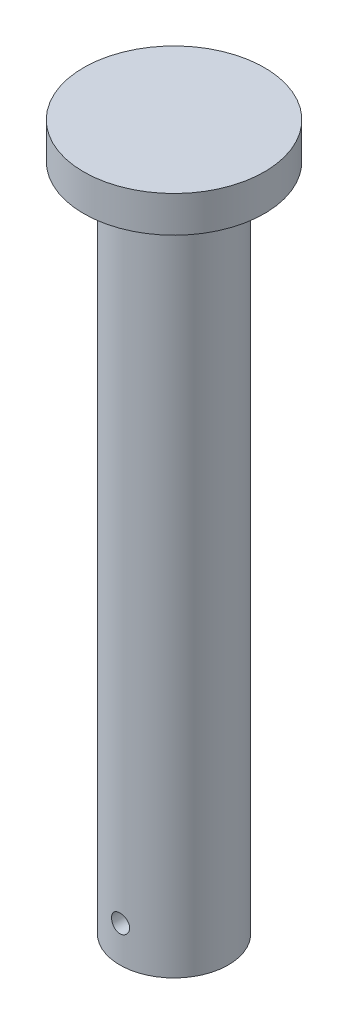
ISO-10303-21;
HEADER;
FILE_DESCRIPTION(('STEP AP214'),'2;1');
FILE_NAME('part.step','',(''),(''),'','','');
FILE_SCHEMA(('AUTOMOTIVE_DESIGN { 1 0 10303 214 1 1 1 1 }'));
ENDSEC;
DATA;
#1=APPLICATION_CONTEXT('core data for automotive mechanical design processes');
#2=APPLICATION_PROTOCOL_DEFINITION('international standard','automotive_design',2000,#1);
#3=PRODUCT_CONTEXT('',#1,'mechanical');
#4=PRODUCT('Part','Part','',(#3));
#5=PRODUCT_RELATED_PRODUCT_CATEGORY('part','',(#4));
#6=PRODUCT_DEFINITION_FORMATION('','',#4);
#7=PRODUCT_DEFINITION_CONTEXT('part definition',#1,'design');
#8=PRODUCT_DEFINITION('design','',#6,#7);
#9=PRODUCT_DEFINITION_SHAPE('','',#8);
#10=(LENGTH_UNIT() NAMED_UNIT(*) SI_UNIT(.MILLI.,.METRE.));
#11=(NAMED_UNIT(*) PLANE_ANGLE_UNIT() SI_UNIT($,.RADIAN.));
#12=(NAMED_UNIT(*) SI_UNIT($,.STERADIAN.) SOLID_ANGLE_UNIT());
#13=UNCERTAINTY_MEASURE_WITH_UNIT(LENGTH_MEASURE(1.E-05),#10,'distance_accuracy_value','');
#14=(GEOMETRIC_REPRESENTATION_CONTEXT(3) GLOBAL_UNCERTAINTY_ASSIGNED_CONTEXT((#13)) GLOBAL_UNIT_ASSIGNED_CONTEXT((#10,
#11,#12)) REPRESENTATION_CONTEXT('',''));
#15=CARTESIAN_POINT('',(0.,0.,0.));
#16=DIRECTION('',(0.,0.,1.));
#17=DIRECTION('',(1.,0.,0.));
#18=AXIS2_PLACEMENT_3D('',#15,#16,#17);
#19=CARTESIAN_POINT('',(0.,5.,0.));
#20=DIRECTION('',(0.,-1.,0.));
#21=DIRECTION('',(0.,0.,-1.));
#22=AXIS2_PLACEMENT_3D('',#19,#20,#21);
#23=CYLINDRICAL_SURFACE('',#22,25.);
#24=CARTESIAN_POINT('',(0.,5.,0.));
#25=DIRECTION('',(0.,1.,0.));
#26=DIRECTION('',(0.,0.,1.));
#27=AXIS2_PLACEMENT_3D('',#24,#25,#26);
#28=CIRCLE('',#27,25.);
#29=CARTESIAN_POINT('',(0.,5.,25.));
#30=VERTEX_POINT('',#29);
#31=EDGE_CURVE('E47',#30,#30,#28,.T.);
#32=ORIENTED_EDGE('',*,*,#31,.F.);
#33=EDGE_LOOP('',(#32));
#34=FACE_BOUND('',#33,.T.);
#35=CARTESIAN_POINT('',(0.,-5.,0.));
#36=DIRECTION('',(0.,1.,0.));
#37=DIRECTION('',(0.,0.,1.));
#38=AXIS2_PLACEMENT_3D('',#35,#36,#37);
#39=CIRCLE('',#38,25.);
#40=CARTESIAN_POINT('',(0.,-5.,25.));
#41=VERTEX_POINT('',#40);
#42=EDGE_CURVE('E52',#41,#41,#39,.T.);
#43=ORIENTED_EDGE('',*,*,#42,.T.);
#44=EDGE_LOOP('',(#43));
#45=FACE_BOUND('',#44,.T.);
#46=ADVANCED_FACE('F35',(#34,#45),#23,.T.);
#47=CARTESIAN_POINT('',(0.,5.,0.));
#48=DIRECTION('',(0.,1.,0.));
#49=DIRECTION('',(0.,0.,1.));
#50=AXIS2_PLACEMENT_3D('',#47,#48,#49);
#51=PLANE('',#50);
#52=ORIENTED_EDGE('',*,*,#31,.T.);
#53=EDGE_LOOP('',(#52));
#54=FACE_BOUND('',#53,.T.);
#55=ADVANCED_FACE('F82',(#54),#51,.T.);
#56=CARTESIAN_POINT('',(0.,-5.,0.));
#57=DIRECTION('',(0.,1.,0.));
#58=DIRECTION('',(0.,0.,1.));
#59=AXIS2_PLACEMENT_3D('',#56,#57,#58);
#60=PLANE('',#59);
#61=CARTESIAN_POINT('',(0.,-5.,0.));
#62=DIRECTION('',(0.,-1.,0.));
#63=DIRECTION('',(0.,0.,-1.));
#64=AXIS2_PLACEMENT_3D('',#61,#62,#63);
#65=CIRCLE('',#64,15.);
#66=CARTESIAN_POINT('',(0.,-5.,-15.));
#67=VERTEX_POINT('',#66);
#68=EDGE_CURVE('E10',#67,#67,#65,.T.);
#69=ORIENTED_EDGE('',*,*,#68,.F.);
#70=EDGE_LOOP('',(#69));
#71=FACE_BOUND('',#70,.T.);
#72=ORIENTED_EDGE('',*,*,#42,.F.);
#73=EDGE_LOOP('',(#72));
#74=FACE_BOUND('',#73,.T.);
#75=ADVANCED_FACE('F78',(#71,#74),#60,.F.);
#76=CARTESIAN_POINT('',(0.,-190.,0.));
#77=DIRECTION('',(0.,1.,0.));
#78=DIRECTION('',(0.,0.,1.));
#79=AXIS2_PLACEMENT_3D('',#76,#77,#78);
#80=CYLINDRICAL_SURFACE('',#79,15.);
#81=CARTESIAN_POINT('',(0.,-182.5,15.));
#82=CARTESIAN_POINT('',(-0.139390904958215,-182.499994411052,14.9999976116882));
#83=CARTESIAN_POINT('',(-0.278857881838821,-182.488302725031,14.9980367791303));
#84=CARTESIAN_POINT('',(-0.553880221673043,-182.441864341235,14.9904034494139));
#85=CARTESIAN_POINT('',(-0.689431867959248,-182.407096443088,14.9847275392389));
#86=CARTESIAN_POINT('',(-0.952604747212644,-182.315584551407,14.9703006823645));
#87=CARTESIAN_POINT('',(-1.0802323684319,-182.258858534359,14.9615522515919));
#88=CARTESIAN_POINT('',(-1.32414184197794,-182.125087707948,14.9419422708207));
#89=CARTESIAN_POINT('',(-1.44042498987859,-182.048045222517,14.9310809625443));
#90=CARTESIAN_POINT('',(-1.65947261429168,-181.87504491618,14.9083331745831));
#91=CARTESIAN_POINT('',(-1.76211290353497,-181.778930885364,14.8964387181486));
#92=CARTESIAN_POINT('',(-1.94988849865993,-181.570852031527,14.8730262687673));
#93=CARTESIAN_POINT('',(-2.03502269939097,-181.458886208543,14.8615082996267));
#94=CARTESIAN_POINT('',(-2.18586712560513,-181.221429033803,14.8400756575978));
#95=CARTESIAN_POINT('',(-2.251454552861,-181.095858663195,14.8301712909164));
#96=CARTESIAN_POINT('',(-2.36055836541122,-180.835290435699,14.8131978979467));
#97=CARTESIAN_POINT('',(-2.40407624156562,-180.700293216322,14.8061286801431));
#98=CARTESIAN_POINT('',(-2.46741437778481,-180.426019725143,14.7957053684276));
#99=CARTESIAN_POINT('',(-2.4874490291354,-180.286794263499,14.792317684857));
#100=CARTESIAN_POINT('',(-2.50391672528988,-180.006919723117,14.7895393893665));
#101=CARTESIAN_POINT('',(-2.500351440389,-179.866270745833,14.7901484945721));
#102=CARTESIAN_POINT('',(-2.46989509839615,-179.589072138725,14.7952642886356));
#103=CARTESIAN_POINT('',(-2.44324488188977,-179.452495196455,14.7997307331892));
#104=CARTESIAN_POINT('',(-2.36775314040344,-179.185778682171,14.8119949521101));
#105=CARTESIAN_POINT('',(-2.31891085431974,-179.055639331111,14.8197928407327));
#106=CARTESIAN_POINT('',(-2.20017724609391,-178.804771176559,14.837884793341));
#107=CARTESIAN_POINT('',(-2.13018591387971,-178.684090593919,14.8481906710733));
#108=CARTESIAN_POINT('',(-1.97121201755743,-178.456095599462,14.8701291841501));
#109=CARTESIAN_POINT('',(-1.88222792065428,-178.348782267545,14.8817619265429));
#110=CARTESIAN_POINT('',(-1.68648221215905,-178.149173914193,14.9052202787979));
#111=CARTESIAN_POINT('',(-1.57951396387313,-178.05708148146,14.9170464923165));
#112=CARTESIAN_POINT('',(-1.35153524898165,-177.892122237335,14.9394260139672));
#113=CARTESIAN_POINT('',(-1.23052469190644,-177.819255549817,14.9499793138974));
#114=CARTESIAN_POINT('',(-0.977705916166733,-177.694797772864,14.9686389289291));
#115=CARTESIAN_POINT('',(-0.845888725564678,-177.643224580669,14.9767431840745));
#116=CARTESIAN_POINT('',(-0.57529834560274,-177.563005784754,14.9895750301266));
#117=CARTESIAN_POINT('',(-0.436525739179473,-177.534358263026,14.9943029035047));
#118=CARTESIAN_POINT('',(-0.157709901301625,-177.501078641539,14.9998112984269));
#119=CARTESIAN_POINT('',(-0.0177007371510126,-177.496168428194,15.0006375301278));
#120=CARTESIAN_POINT('',(0.261139772889886,-177.509761344428,14.9983747442117));
#121=CARTESIAN_POINT('',(0.399971163892038,-177.528263573134,14.9952858772412));
#122=CARTESIAN_POINT('',(0.671656175546762,-177.587924849335,14.985568269382));
#123=CARTESIAN_POINT('',(0.804540868385377,-177.62894620839,14.9789610480131));
#124=CARTESIAN_POINT('',(1.06154688486044,-177.7323345182,14.9629446445536));
#125=CARTESIAN_POINT('',(1.18566771590972,-177.794702667635,14.9535353051202));
#126=CARTESIAN_POINT('',(1.42283068946897,-177.939651124697,14.9328451630241));
#127=CARTESIAN_POINT('',(1.53576525093715,-178.022405156167,14.9215485588702));
#128=CARTESIAN_POINT('',(1.74624358550269,-178.205537315385,14.898384673919));
#129=CARTESIAN_POINT('',(1.84378623969658,-178.305916723277,14.8865173517155));
#130=CARTESIAN_POINT('',(2.02174277965801,-178.522697548071,14.8634017523585));
#131=CARTESIAN_POINT('',(2.10196876111372,-178.639254165514,14.8521611613711));
#132=CARTESIAN_POINT('',(2.24170231029499,-178.884352969139,14.8317152977788));
#133=CARTESIAN_POINT('',(2.30121053476983,-179.012894775227,14.8225099606602));
#134=CARTESIAN_POINT('',(2.39753833147315,-179.277789732812,14.807234536977));
#135=CARTESIAN_POINT('',(2.43445143254794,-179.414108095031,14.8011515431106));
#136=CARTESIAN_POINT('',(2.48483545377828,-179.691120129222,14.7927771683526));
#137=CARTESIAN_POINT('',(2.49830841194617,-179.831813419732,14.7904854578272));
#138=CARTESIAN_POINT('',(2.50137286604735,-180.111705165962,14.7899673308401));
#139=CARTESIAN_POINT('',(2.49126013612519,-180.250900378575,14.7916905650565));
#140=CARTESIAN_POINT('',(2.44807983895685,-180.525579248051,14.7988978145373));
#141=CARTESIAN_POINT('',(2.41501234611248,-180.661062916942,14.8043818176121));
#142=CARTESIAN_POINT('',(2.3269744895949,-180.924358437293,14.8184735628172));
#143=CARTESIAN_POINT('',(2.27202959060043,-181.052179010056,14.8270776721967));
#144=CARTESIAN_POINT('',(2.1418270039159,-181.296835669195,14.8464436892221));
#145=CARTESIAN_POINT('',(2.06656830874856,-181.413671210372,14.857205703884));
#146=CARTESIAN_POINT('',(1.89681888437215,-181.634535583108,14.8798345404562));
#147=CARTESIAN_POINT('',(1.80211056359365,-181.7383960167,14.891712955763));
#148=CARTESIAN_POINT('',(1.59660903138024,-181.928851604475,14.9151437236084));
#149=CARTESIAN_POINT('',(1.48581211291265,-182.015442768638,14.9266960002655));
#150=CARTESIAN_POINT('',(1.25036916964029,-182.1694482682,14.9482652964222));
#151=CARTESIAN_POINT('',(1.12563278753283,-182.236726039313,14.958271162531));
#152=CARTESIAN_POINT('',(0.866513069378982,-182.34926948461,14.9755116760178));
#153=CARTESIAN_POINT('',(0.732139494830003,-182.39455708108,14.9827490817748));
#154=CARTESIAN_POINT('',(0.49770331004539,-182.452005274127,14.9920579083296));
#155=CARTESIAN_POINT('',(0.39905883029844,-182.469974469616,14.9950202727336));
#156=CARTESIAN_POINT('',(0.200289310319806,-182.493973737845,14.9989921598612));
#157=CARTESIAN_POINT('',(0.100164295608492,-182.500004016137,15.0000017162064));
#158=CARTESIAN_POINT('',(0.,-182.5,15.));
#159=B_SPLINE_CURVE_WITH_KNOTS('',3,(#81,#82,#83,#84,#85,#86,#87,#88,#89,#90,#91,#92,#93,#94,
#95,#96,#97,#98,#99,#100,#101,#102,#103,#104,#105,#106,#107,#108,#109,#110,#111,#112,#113,#114,
#115,#116,#117,#118,#119,#120,#121,#122,#123,#124,#125,#126,#127,#128,#129,#130,#131,#132,#133,
#134,#135,#136,#137,#138,#139,#140,#141,#142,#143,#144,#145,#146,#147,#148,#149,#150,#151,#152,
#153,#154,#155,#156,#157,#158),.UNSPECIFIED.,.T.,.F.,(4,2,2,2,2,2,2,2,2,2,2,2,2,2,2,2,2,2,2,2,2,
2,2,2,2,2,2,2,2,2,2,2,2,2,2,2,2,2,4),(0.,0.417806584938511,0.83599754569542,1.25384686702527,
1.67164841267479,2.09302491062332,2.51442800169854,2.9384252082384,3.36239376876183,
3.78246077103426,4.20249804320889,4.61820521760411,5.03392665025382,5.45164556632559,
5.86939820680575,6.29232769911326,6.71525991635845,7.13854688915902,7.56179844521149,
7.98007883491397,8.39834313035859,8.81407807006415,9.22983635826068,9.64926825627026,
10.0687306305428,10.4925382200762,10.9163323737594,11.3383602234177,11.7603513778662,
12.177079095227,12.5938054618813,13.0100481822622,13.4263115502934,13.8475138419339,
14.2688133387897,14.693022316072,15.1168075213007,15.4170424816402,15.7172722727697),.UNSPECIFIED.);
#160=CARTESIAN_POINT('',(0.,-182.5,15.));
#161=VERTEX_POINT('',#160);
#162=EDGE_CURVE('E38',#161,#161,#159,.T.);
#163=ORIENTED_EDGE('',*,*,#162,.T.);
#164=EDGE_LOOP('',(#163));
#165=FACE_BOUND('',#164,.T.);
#166=CARTESIAN_POINT('',(2.5,-180.,-14.790199457749));
#167=CARTESIAN_POINT('',(2.49999439841983,-179.860624251838,-14.790201973666));
#168=CARTESIAN_POINT('',(2.48830516902828,-179.721172393929,-14.7921909238523));
#169=CARTESIAN_POINT('',(2.44187742806638,-179.446181456737,-14.7999245720004));
#170=CARTESIAN_POINT('',(2.40711766030861,-179.310646106242,-14.8056727334637));
#171=CARTESIAN_POINT('',(2.31562954367049,-179.047507716658,-14.8202560936731));
#172=CARTESIAN_POINT('',(2.25891955493198,-178.919898151338,-14.8290887118401));
#173=CARTESIAN_POINT('',(2.12518649688946,-178.676019045282,-14.8488427210228));
#174=CARTESIAN_POINT('',(2.04816571350132,-178.559748230423,-14.8597638769423));
#175=CARTESIAN_POINT('',(1.87518752696653,-178.340687150255,-14.8825847115588));
#176=CARTESIAN_POINT('',(1.77906904893232,-178.238024868614,-14.8944921732795));
#177=CARTESIAN_POINT('',(1.57097200469526,-178.050206693138,-14.9178748066858));
#178=CARTESIAN_POINT('',(1.45899249914996,-177.965051836885,-14.9293499527174));
#179=CARTESIAN_POINT('',(1.22152286994836,-177.814185432781,-14.9506573698271));
#180=CARTESIAN_POINT('',(1.09595608145671,-177.748592992268,-14.9604794243234));
#181=CARTESIAN_POINT('',(0.835395621723877,-177.639478929469,-14.9772873695709));
#182=CARTESIAN_POINT('',(0.700402564078195,-177.595955872115,-14.9842734447266));
#183=CARTESIAN_POINT('',(0.426143726344249,-177.532607465016,-14.994567347244));
#184=CARTESIAN_POINT('',(0.28692888667928,-177.512567083995,-14.9979085311091));
#185=CARTESIAN_POINT('',(0.00707528552580701,-177.496084245847,-15.0006507934278));
#186=CARTESIAN_POINT('',(-0.13356337852889,-177.499640184753,-15.0000521396931));
#187=CARTESIAN_POINT('',(-0.410802185078865,-177.530081351528,-14.9950085843139));
#188=CARTESIAN_POINT('',(-0.547428530700127,-177.556735163409,-14.990601836924));
#189=CARTESIAN_POINT('',(-0.814241979611779,-177.632251074246,-14.9784797877164));
#190=CARTESIAN_POINT('',(-0.944428886651497,-177.681113849589,-14.9707643851321));
#191=CARTESIAN_POINT('',(-1.19535614778264,-177.799890640315,-14.9528269851196));
#192=CARTESIAN_POINT('',(-1.31605052301904,-177.869900012082,-14.9425936732688));
#193=CARTESIAN_POINT('',(-1.54406552984663,-178.028912822635,-14.920757380715));
#194=CARTESIAN_POINT('',(-1.65138507791587,-178.117917798711,-14.9091542891913));
#195=CARTESIAN_POINT('',(-1.85097127344666,-178.313678806619,-14.885702682326));
#196=CARTESIAN_POINT('',(-1.94303950225321,-178.420637094901,-14.8738528973104));
#197=CARTESIAN_POINT('',(-2.10795458844806,-178.648587090216,-14.8513795978481));
#198=CARTESIAN_POINT('',(-2.18080126853242,-178.769578926683,-14.8407560947132));
#199=CARTESIAN_POINT('',(-2.30524443448828,-179.022391641877,-14.8219375456182));
#200=CARTESIAN_POINT('',(-2.35681702727923,-179.154224498092,-14.813745233026));
#201=CARTESIAN_POINT('',(-2.43702987081561,-179.424849072308,-14.8007618868988));
#202=CARTESIAN_POINT('',(-2.46567214076795,-179.563640176432,-14.7959705538832));
#203=CARTESIAN_POINT('',(-2.49893188487927,-179.842466156162,-14.7903895942212));
#204=CARTESIAN_POINT('',(-2.50383220791244,-179.982466379702,-14.7895528575867));
#205=CARTESIAN_POINT('',(-2.49022270268246,-180.261286671691,-14.7918503478236));
#206=CARTESIAN_POINT('',(-2.47171377862467,-180.400106785514,-14.7949844213185));
#207=CARTESIAN_POINT('',(-2.4120523349281,-180.671727759191,-14.8048268745502));
#208=CARTESIAN_POINT('',(-2.37104379064639,-180.804561139878,-14.8115125191835));
#209=CARTESIAN_POINT('',(-2.26769819019229,-181.061470166279,-14.827685730055));
#210=CARTESIAN_POINT('',(-2.20535985810096,-181.185545287551,-14.8371734639058));
#211=CARTESIAN_POINT('',(-2.06045667322925,-181.422674594406,-14.8579912839739));
#212=CARTESIAN_POINT('',(-1.97771056415938,-181.535616572756,-14.8693375560035));
#213=CARTESIAN_POINT('',(-1.79458946570799,-181.746113532695,-14.8925466667987));
#214=CARTESIAN_POINT('',(-1.69421323638406,-181.84366743111,-14.9044095418533));
#215=CARTESIAN_POINT('',(-1.47742807032882,-182.021651892729,-14.9274642211826));
#216=CARTESIAN_POINT('',(-1.3608632533862,-182.101893826285,-14.9386477634467));
#217=CARTESIAN_POINT('',(-1.11574344794933,-182.241655327005,-14.9589511243294));
#218=CARTESIAN_POINT('',(-0.987188847470634,-182.301175564474,-14.9680710096998));
#219=CARTESIAN_POINT('',(-0.722299051501337,-182.397510583955,-14.9831835816958));
#220=CARTESIAN_POINT('',(-0.586000562602617,-182.434424075735,-14.9891898456762));
#221=CARTESIAN_POINT('',(-0.309030734874212,-182.484815598964,-14.9974558316928));
#222=CARTESIAN_POINT('',(-0.16835975682162,-182.498295558732,-14.9997158620019));
#223=CARTESIAN_POINT('',(0.111541275773677,-182.501381882312,-15.0002303788781));
#224=CARTESIAN_POINT('',(0.250768160602664,-182.491275253941,-14.9985330202419));
#225=CARTESIAN_POINT('',(0.525511974314702,-182.448096077731,-14.9914217838733));
#226=CARTESIAN_POINT('',(0.661028923967475,-182.41502365849,-14.9860079269518));
#227=CARTESIAN_POINT('',(0.924396445918529,-182.326961834456,-14.972069888274));
#228=CARTESIAN_POINT('',(1.05225537215381,-182.27199683179,-14.9635491704088));
#229=CARTESIAN_POINT('',(1.29698045298215,-182.141742063769,-14.9443275687803));
#230=CARTESIAN_POINT('',(1.41384608611821,-182.066451334938,-14.9336265816741));
#231=CARTESIAN_POINT('',(1.63471294552638,-181.89666490754,-14.9110762961641));
#232=CARTESIAN_POINT('',(1.73855143060273,-181.801959045249,-14.8992152454112));
#233=CARTESIAN_POINT('',(1.92896387595089,-181.596471692096,-14.8757630331437));
#234=CARTESIAN_POINT('',(2.01553378671188,-181.485686441087,-14.8641719354951));
#235=CARTESIAN_POINT('',(2.16951427091085,-181.25025467751,-14.8424834353391));
#236=CARTESIAN_POINT('',(2.23678498905769,-181.125515660235,-14.8323971784578));
#237=CARTESIAN_POINT('',(2.34931453640427,-180.866390764162,-14.8149921009131));
#238=CARTESIAN_POINT('',(2.39459535522307,-180.732014677323,-14.8076705172488));
#239=CARTESIAN_POINT('',(2.45202605312742,-180.497596230513,-14.7982474485649));
#240=CARTESIAN_POINT('',(2.46998741767139,-180.398973192037,-14.7952462341947));
#241=CARTESIAN_POINT('',(2.49397629518131,-180.200246515163,-14.7912213528807));
#242=CARTESIAN_POINT('',(2.50000402479277,-180.100142903676,-14.7901976500369));
#243=CARTESIAN_POINT('',(2.5,-180.,-14.790199457749));
#244=B_SPLINE_CURVE_WITH_KNOTS('',3,(#166,#167,#168,#169,#170,#171,#172,#173,#174,#175,#176,
#177,#178,#179,#180,#181,#182,#183,#184,#185,#186,#187,#188,#189,#190,#191,#192,#193,#194,#195,
#196,#197,#198,#199,#200,#201,#202,#203,#204,#205,#206,#207,#208,#209,#210,#211,#212,#213,#214,
#215,#216,#217,#218,#219,#220,#221,#222,#223,#224,#225,#226,#227,#228,#229,#230,#231,#232,#233,
#234,#235,#236,#237,#238,#239,#240,#241,#242,#243),.UNSPECIFIED.,.T.,.F.,(4,2,2,2,2,2,2,2,2,2,2,
2,2,2,2,2,2,2,2,2,2,2,2,2,2,2,2,2,2,2,2,2,2,2,2,2,2,2,4),(0.,0.417761038927708,
0.835907519962962,1.25370499787522,1.67145547405275,2.09289159155718,2.51435267834448,
2.93832980111435,3.36227935111112,3.78231567472565,4.20232344652691,4.61817121164667,
5.03403164249533,5.45179604139425,5.86959426226764,6.29246123462125,6.71533210746018,
7.13867662498602,7.56198385938074,7.98023542420408,8.39847083413977,8.81406064635489,
9.22967532293572,9.64912342762701,10.0686010443069,10.4924411303538,10.916267504767,
11.3382298441765,11.7601574591235,12.1769777626592,12.5937957321882,13.0101503983246,
13.4265248039234,13.8476699746325,14.2689137888181,14.6931372761832,15.1169356674445,
15.4171067054376,15.7172722940182),.UNSPECIFIED.);
#245=CARTESIAN_POINT('',(2.5,-180.,-14.790199457749));
#246=VERTEX_POINT('',#245);
#247=EDGE_CURVE('E58',#246,#246,#244,.T.);
#248=ORIENTED_EDGE('',*,*,#247,.T.);
#249=EDGE_LOOP('',(#248));
#250=FACE_BOUND('',#249,.T.);
#251=CARTESIAN_POINT('',(0.,-190.,0.));
#252=DIRECTION('',(0.,-1.,0.));
#253=DIRECTION('',(0.,0.,-1.));
#254=AXIS2_PLACEMENT_3D('',#251,#252,#253);
#255=CIRCLE('',#254,15.);
#256=CARTESIAN_POINT('',(0.,-190.,-15.));
#257=VERTEX_POINT('',#256);
#258=EDGE_CURVE('E55',#257,#257,#255,.T.);
#259=ORIENTED_EDGE('',*,*,#258,.F.);
#260=EDGE_LOOP('',(#259));
#261=FACE_BOUND('',#260,.T.);
#262=ORIENTED_EDGE('',*,*,#68,.T.);
#263=EDGE_LOOP('',(#262));
#264=FACE_BOUND('',#263,.T.);
#265=ADVANCED_FACE('F63',(#165,#250,#261,#264),#80,.T.);
#266=CARTESIAN_POINT('',(0.,-190.,0.));
#267=DIRECTION('',(0.,-1.,0.));
#268=DIRECTION('',(0.,0.,-1.));
#269=AXIS2_PLACEMENT_3D('',#266,#267,#268);
#270=PLANE('',#269);
#271=ORIENTED_EDGE('',*,*,#258,.T.);
#272=EDGE_LOOP('',(#271));
#273=FACE_BOUND('',#272,.T.);
#274=ADVANCED_FACE('F70',(#273),#270,.T.);
#275=CARTESIAN_POINT('',(0.,-180.,-25.));
#276=DIRECTION('',(0.,0.,1.));
#277=DIRECTION('',(1.,0.,0.));
#278=AXIS2_PLACEMENT_3D('',#275,#276,#277);
#279=CYLINDRICAL_SURFACE('',#278,2.5);
#280=ORIENTED_EDGE('',*,*,#247,.F.);
#281=EDGE_LOOP('',(#280));
#282=FACE_BOUND('',#281,.T.);
#283=ORIENTED_EDGE('',*,*,#162,.F.);
#284=EDGE_LOOP('',(#283));
#285=FACE_BOUND('',#284,.T.);
#286=ADVANCED_FACE('F67',(#282,#285),#279,.F.);
#287=CLOSED_SHELL('',(#46,#55,#75,#265,#274,#286));
#288=MANIFOLD_SOLID_BREP('B2',#287);
#289=ADVANCED_BREP_SHAPE_REPRESENTATION('',(#18,#288),#14);
#290=SHAPE_DEFINITION_REPRESENTATION(#9,#289);
ENDSEC;
END-ISO-10303-21;
